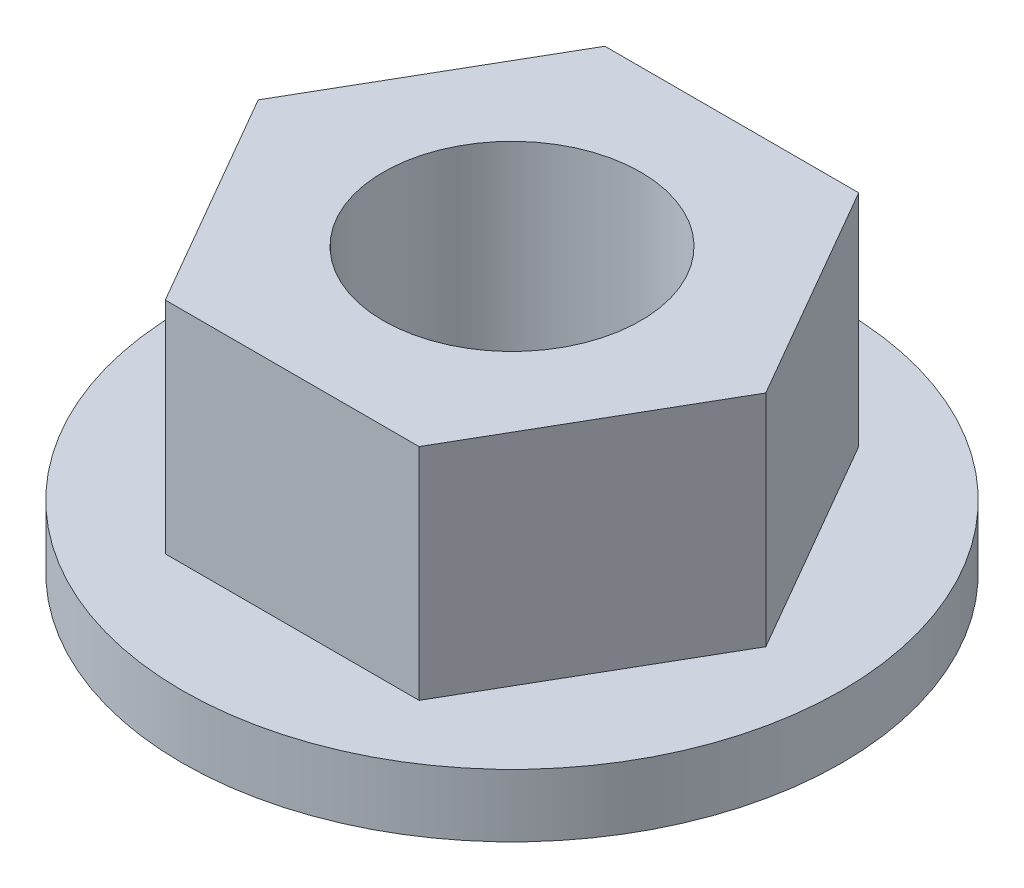
ISO-10303-21;
HEADER;
FILE_DESCRIPTION(('STEP AP214'),'2;1');
FILE_NAME('part.step','',(''),(''),'','','');
FILE_SCHEMA(('AUTOMOTIVE_DESIGN { 1 0 10303 214 1 1 1 1 }'));
ENDSEC;
DATA;
#1=APPLICATION_CONTEXT('core data for automotive mechanical design processes');
#2=APPLICATION_PROTOCOL_DEFINITION('international standard','automotive_design',2000,#1);
#3=PRODUCT_CONTEXT('',#1,'mechanical');
#4=PRODUCT('Part','Part','',(#3));
#5=PRODUCT_RELATED_PRODUCT_CATEGORY('part','',(#4));
#6=PRODUCT_DEFINITION_FORMATION('','',#4);
#7=PRODUCT_DEFINITION_CONTEXT('part definition',#1,'design');
#8=PRODUCT_DEFINITION('design','',#6,#7);
#9=PRODUCT_DEFINITION_SHAPE('','',#8);
#10=(LENGTH_UNIT() NAMED_UNIT(*) SI_UNIT(.MILLI.,.METRE.));
#11=(NAMED_UNIT(*) PLANE_ANGLE_UNIT() SI_UNIT($,.RADIAN.));
#12=(NAMED_UNIT(*) SI_UNIT($,.STERADIAN.) SOLID_ANGLE_UNIT());
#13=UNCERTAINTY_MEASURE_WITH_UNIT(LENGTH_MEASURE(1.E-05),#10,'distance_accuracy_value','');
#14=(GEOMETRIC_REPRESENTATION_CONTEXT(3) GLOBAL_UNCERTAINTY_ASSIGNED_CONTEXT((#13)) GLOBAL_UNIT_ASSIGNED_CONTEXT((#10,
#11,#12)) REPRESENTATION_CONTEXT('',''));
#15=CARTESIAN_POINT('',(0.,0.,0.));
#16=DIRECTION('',(0.,0.,1.));
#17=DIRECTION('',(1.,0.,0.));
#18=AXIS2_PLACEMENT_3D('',#15,#16,#17);
#19=CARTESIAN_POINT('',(-18.2709253038248,135.,-3.5));
#20=DIRECTION('',(0.866025403784438,0.,-0.5));
#21=DIRECTION('',(-0.5,0.,-0.866025403784439));
#22=AXIS2_PLACEMENT_3D('',#19,#20,#21);
#23=PLANE('',#22);
#24=DIRECTION('',(-0.5,0.,-0.866025403784439));
#25=VECTOR('',#24,1.);
#26=CARTESIAN_POINT('',(-18.2709253038248,138.5,-3.5));
#27=LINE('',#26,#25);
#28=CARTESIAN_POINT('',(-16.2501993616611,138.5,0.));
#29=VERTEX_POINT('',#28);
#30=CARTESIAN_POINT('',(-18.2709253038248,138.5,-3.5));
#31=VERTEX_POINT('',#30);
#32=EDGE_CURVE('E127',#29,#31,#27,.T.);
#33=ORIENTED_EDGE('',*,*,#32,.F.);
#34=DIRECTION('',(0.,1.,0.));
#35=VECTOR('',#34,1.);
#36=CARTESIAN_POINT('',(-16.2501993616611,135.,0.));
#37=LINE('',#36,#35);
#38=CARTESIAN_POINT('',(-16.2501993616611,135.,0.));
#39=VERTEX_POINT('',#38);
#40=EDGE_CURVE('E11',#39,#29,#37,.T.);
#41=ORIENTED_EDGE('',*,*,#40,.F.);
#42=DIRECTION('',(-0.5,0.,-0.866025403784439));
#43=VECTOR('',#42,1.);
#44=CARTESIAN_POINT('',(-18.2709253038248,135.,-3.5));
#45=LINE('',#44,#43);
#46=CARTESIAN_POINT('',(-18.2709253038248,135.,-3.5));
#47=VERTEX_POINT('',#46);
#48=EDGE_CURVE('E102',#39,#47,#45,.T.);
#49=ORIENTED_EDGE('',*,*,#48,.T.);
#50=DIRECTION('',(0.,1.,0.));
#51=VECTOR('',#50,1.);
#52=CARTESIAN_POINT('',(-18.2709253038248,135.,-3.5));
#53=LINE('',#52,#51);
#54=EDGE_CURVE('E113',#47,#31,#53,.T.);
#55=ORIENTED_EDGE('',*,*,#54,.T.);
#56=EDGE_LOOP('',(#33,#41,#49,#55));
#57=FACE_BOUND('',#56,.T.);
#58=ADVANCED_FACE('F39',(#57),#23,.T.);
#59=CARTESIAN_POINT('',(-16.2501993616611,135.,0.));
#60=DIRECTION('',(0.866025403784438,0.,0.5));
#61=DIRECTION('',(0.5,0.,-0.866025403784439));
#62=AXIS2_PLACEMENT_3D('',#59,#60,#61);
#63=PLANE('',#62);
#64=DIRECTION('',(0.5,0.,-0.866025403784439));
#65=VECTOR('',#64,1.);
#66=CARTESIAN_POINT('',(-16.2501993616611,138.5,0.));
#67=LINE('',#66,#65);
#68=CARTESIAN_POINT('',(-18.2709253038248,138.5,3.5));
#69=VERTEX_POINT('',#68);
#70=EDGE_CURVE('E96',#69,#29,#67,.T.);
#71=ORIENTED_EDGE('',*,*,#70,.F.);
#72=DIRECTION('',(0.,1.,0.));
#73=VECTOR('',#72,1.);
#74=CARTESIAN_POINT('',(-18.2709253038248,135.,3.5));
#75=LINE('',#74,#73);
#76=CARTESIAN_POINT('',(-18.2709253038248,135.,3.5));
#77=VERTEX_POINT('',#76);
#78=EDGE_CURVE('E48',#77,#69,#75,.T.);
#79=ORIENTED_EDGE('',*,*,#78,.F.);
#80=DIRECTION('',(0.5,0.,-0.866025403784439));
#81=VECTOR('',#80,1.);
#82=CARTESIAN_POINT('',(-16.2501993616611,135.,0.));
#83=LINE('',#82,#81);
#84=EDGE_CURVE('E116',#77,#39,#83,.T.);
#85=ORIENTED_EDGE('',*,*,#84,.T.);
#86=ORIENTED_EDGE('',*,*,#40,.T.);
#87=EDGE_LOOP('',(#71,#79,#85,#86));
#88=FACE_BOUND('',#87,.T.);
#89=ADVANCED_FACE('F101',(#88),#63,.T.);
#90=CARTESIAN_POINT('',(-18.2709253038248,135.,3.5));
#91=DIRECTION('',(0.,0.,1.));
#92=DIRECTION('',(1.,0.,0.));
#93=AXIS2_PLACEMENT_3D('',#90,#91,#92);
#94=PLANE('',#93);
#95=DIRECTION('',(1.,0.,0.));
#96=VECTOR('',#95,1.);
#97=CARTESIAN_POINT('',(-18.2709253038248,138.5,3.5));
#98=LINE('',#97,#96);
#99=CARTESIAN_POINT('',(-22.3123771881522,138.5,3.5));
#100=VERTEX_POINT('',#99);
#101=EDGE_CURVE('E85',#100,#69,#98,.T.);
#102=ORIENTED_EDGE('',*,*,#101,.F.);
#103=DIRECTION('',(0.,1.,0.));
#104=VECTOR('',#103,1.);
#105=CARTESIAN_POINT('',(-22.3123771881522,135.,3.5));
#106=LINE('',#105,#104);
#107=CARTESIAN_POINT('',(-22.3123771881522,135.,3.5));
#108=VERTEX_POINT('',#107);
#109=EDGE_CURVE('E89',#108,#100,#106,.T.);
#110=ORIENTED_EDGE('',*,*,#109,.F.);
#111=DIRECTION('',(1.,0.,0.));
#112=VECTOR('',#111,1.);
#113=CARTESIAN_POINT('',(-18.2709253038248,135.,3.5));
#114=LINE('',#113,#112);
#115=EDGE_CURVE('E88',#108,#77,#114,.T.);
#116=ORIENTED_EDGE('',*,*,#115,.T.);
#117=ORIENTED_EDGE('',*,*,#78,.T.);
#118=EDGE_LOOP('',(#102,#110,#116,#117));
#119=FACE_BOUND('',#118,.T.);
#120=ADVANCED_FACE('F80',(#119),#94,.T.);
#121=CARTESIAN_POINT('',(-22.3123771881522,135.,3.5));
#122=DIRECTION('',(-0.866025403784438,0.,0.5));
#123=DIRECTION('',(0.5,0.,0.866025403784439));
#124=AXIS2_PLACEMENT_3D('',#121,#122,#123);
#125=PLANE('',#124);
#126=DIRECTION('',(0.5,0.,0.866025403784439));
#127=VECTOR('',#126,1.);
#128=CARTESIAN_POINT('',(-22.3123771881522,138.5,3.5));
#129=LINE('',#128,#127);
#130=CARTESIAN_POINT('',(-24.3331031303159,138.5,0.));
#131=VERTEX_POINT('',#130);
#132=EDGE_CURVE('E97',#131,#100,#129,.T.);
#133=ORIENTED_EDGE('',*,*,#132,.F.);
#134=DIRECTION('',(0.,1.,0.));
#135=VECTOR('',#134,1.);
#136=CARTESIAN_POINT('',(-24.3331031303159,135.,0.));
#137=LINE('',#136,#135);
#138=CARTESIAN_POINT('',(-24.3331031303159,135.,0.));
#139=VERTEX_POINT('',#138);
#140=EDGE_CURVE('E115',#139,#131,#137,.T.);
#141=ORIENTED_EDGE('',*,*,#140,.F.);
#142=DIRECTION('',(0.5,0.,0.866025403784439));
#143=VECTOR('',#142,1.);
#144=CARTESIAN_POINT('',(-22.3123771881522,135.,3.5));
#145=LINE('',#144,#143);
#146=EDGE_CURVE('E125',#139,#108,#145,.T.);
#147=ORIENTED_EDGE('',*,*,#146,.T.);
#148=ORIENTED_EDGE('',*,*,#109,.T.);
#149=EDGE_LOOP('',(#133,#141,#147,#148));
#150=FACE_BOUND('',#149,.T.);
#151=ADVANCED_FACE('F143',(#150),#125,.T.);
#152=CARTESIAN_POINT('',(-24.3331031303159,135.,0.));
#153=DIRECTION('',(-0.866025403784439,0.,-0.499999999999999));
#154=DIRECTION('',(-0.499999999999999,0.,0.866025403784439));
#155=AXIS2_PLACEMENT_3D('',#152,#153,#154);
#156=PLANE('',#155);
#157=DIRECTION('',(-0.499999999999999,0.,0.866025403784439));
#158=VECTOR('',#157,1.);
#159=CARTESIAN_POINT('',(-24.3331031303159,138.5,0.));
#160=LINE('',#159,#158);
#161=CARTESIAN_POINT('',(-22.3123771881522,138.5,-3.5));
#162=VERTEX_POINT('',#161);
#163=EDGE_CURVE('E132',#162,#131,#160,.T.);
#164=ORIENTED_EDGE('',*,*,#163,.F.);
#165=DIRECTION('',(0.,1.,0.));
#166=VECTOR('',#165,1.);
#167=CARTESIAN_POINT('',(-22.3123771881522,135.,-3.5));
#168=LINE('',#167,#166);
#169=CARTESIAN_POINT('',(-22.3123771881522,135.,-3.5));
#170=VERTEX_POINT('',#169);
#171=EDGE_CURVE('E111',#170,#162,#168,.T.);
#172=ORIENTED_EDGE('',*,*,#171,.F.);
#173=DIRECTION('',(-0.499999999999999,0.,0.866025403784439));
#174=VECTOR('',#173,1.);
#175=CARTESIAN_POINT('',(-24.3331031303159,135.,0.));
#176=LINE('',#175,#174);
#177=EDGE_CURVE('E57',#170,#139,#176,.T.);
#178=ORIENTED_EDGE('',*,*,#177,.T.);
#179=ORIENTED_EDGE('',*,*,#140,.T.);
#180=EDGE_LOOP('',(#164,#172,#178,#179));
#181=FACE_BOUND('',#180,.T.);
#182=ADVANCED_FACE('F135',(#181),#156,.T.);
#183=CARTESIAN_POINT('',(-22.3123771881522,135.,-3.5));
#184=DIRECTION('',(0.,0.,-1.));
#185=DIRECTION('',(-1.,0.,0.));
#186=AXIS2_PLACEMENT_3D('',#183,#184,#185);
#187=PLANE('',#186);
#188=DIRECTION('',(-1.,0.,0.));
#189=VECTOR('',#188,1.);
#190=CARTESIAN_POINT('',(-22.3123771881522,138.5,-3.5));
#191=LINE('',#190,#189);
#192=EDGE_CURVE('E126',#31,#162,#191,.T.);
#193=ORIENTED_EDGE('',*,*,#192,.F.);
#194=ORIENTED_EDGE('',*,*,#54,.F.);
#195=DIRECTION('',(-1.,0.,0.));
#196=VECTOR('',#195,1.);
#197=CARTESIAN_POINT('',(-22.3123771881522,135.,-3.5));
#198=LINE('',#197,#196);
#199=EDGE_CURVE('E110',#47,#170,#198,.T.);
#200=ORIENTED_EDGE('',*,*,#199,.T.);
#201=ORIENTED_EDGE('',*,*,#171,.T.);
#202=EDGE_LOOP('',(#193,#194,#200,#201));
#203=FACE_BOUND('',#202,.T.);
#204=ADVANCED_FACE('F151',(#203),#187,.T.);
#205=CARTESIAN_POINT('',(0.,138.5,0.));
#206=DIRECTION('',(0.,-1.,0.));
#207=DIRECTION('',(0.,0.,-1.));
#208=AXIS2_PLACEMENT_3D('',#205,#206,#207);
#209=PLANE('',#208);
#210=CARTESIAN_POINT('',(-20.2916512459885,138.5,0.));
#211=DIRECTION('',(0.,-1.,0.));
#212=DIRECTION('',(0.,0.,-1.));
#213=AXIS2_PLACEMENT_3D('',#210,#211,#212);
#214=CIRCLE('',#213,2.05);
#215=CARTESIAN_POINT('',(-20.2916512459885,138.5,-2.05));
#216=VERTEX_POINT('',#215);
#217=EDGE_CURVE('E185',#216,#216,#214,.T.);
#218=ORIENTED_EDGE('',*,*,#217,.T.);
#219=EDGE_LOOP('',(#218));
#220=FACE_BOUND('',#219,.T.);
#221=ORIENTED_EDGE('',*,*,#32,.T.);
#222=ORIENTED_EDGE('',*,*,#192,.T.);
#223=ORIENTED_EDGE('',*,*,#163,.T.);
#224=ORIENTED_EDGE('',*,*,#132,.T.);
#225=ORIENTED_EDGE('',*,*,#101,.T.);
#226=ORIENTED_EDGE('',*,*,#70,.T.);
#227=EDGE_LOOP('',(#221,#222,#223,#224,#225,#226));
#228=FACE_BOUND('',#227,.T.);
#229=ADVANCED_FACE('F92',(#220,#228),#209,.F.);
#230=CARTESIAN_POINT('',(-20.2916512459885,135.,0.));
#231=DIRECTION('',(0.,1.,0.));
#232=DIRECTION('',(0.,0.,1.));
#233=AXIS2_PLACEMENT_3D('',#230,#231,#232);
#234=PLANE('',#233);
#235=CARTESIAN_POINT('',(-20.2916512459885,135.,0.));
#236=DIRECTION('',(0.,1.,0.));
#237=DIRECTION('',(0.,0.,1.));
#238=AXIS2_PLACEMENT_3D('',#235,#236,#237);
#239=CIRCLE('',#238,5.25);
#240=CARTESIAN_POINT('',(-20.2916512459885,135.,5.25));
#241=VERTEX_POINT('',#240);
#242=EDGE_CURVE('E184',#241,#241,#239,.T.);
#243=ORIENTED_EDGE('',*,*,#242,.T.);
#244=EDGE_LOOP('',(#243));
#245=FACE_BOUND('',#244,.T.);
#246=ORIENTED_EDGE('',*,*,#48,.F.);
#247=ORIENTED_EDGE('',*,*,#84,.F.);
#248=ORIENTED_EDGE('',*,*,#115,.F.);
#249=ORIENTED_EDGE('',*,*,#146,.F.);
#250=ORIENTED_EDGE('',*,*,#177,.F.);
#251=ORIENTED_EDGE('',*,*,#199,.F.);
#252=EDGE_LOOP('',(#246,#247,#248,#249,#250,#251));
#253=FACE_BOUND('',#252,.T.);
#254=ADVANCED_FACE('F146',(#245,#253),#234,.T.);
#255=CARTESIAN_POINT('',(-20.2916512459885,134.,0.));
#256=DIRECTION('',(0.,1.,0.));
#257=DIRECTION('',(0.,0.,1.));
#258=AXIS2_PLACEMENT_3D('',#255,#256,#257);
#259=CYLINDRICAL_SURFACE('',#258,5.25);
#260=CARTESIAN_POINT('',(-20.2916512459885,134.,0.));
#261=DIRECTION('',(0.,1.,0.));
#262=DIRECTION('',(0.,0.,1.));
#263=AXIS2_PLACEMENT_3D('',#260,#261,#262);
#264=CIRCLE('',#263,5.25);
#265=CARTESIAN_POINT('',(-20.2916512459885,134.,5.25));
#266=VERTEX_POINT('',#265);
#267=EDGE_CURVE('E129',#266,#266,#264,.T.);
#268=ORIENTED_EDGE('',*,*,#267,.T.);
#269=EDGE_LOOP('',(#268));
#270=FACE_BOUND('',#269,.T.);
#271=ORIENTED_EDGE('',*,*,#242,.F.);
#272=EDGE_LOOP('',(#271));
#273=FACE_BOUND('',#272,.T.);
#274=ADVANCED_FACE('F180',(#270,#273),#259,.T.);
#275=CARTESIAN_POINT('',(-20.2916512459885,134.,0.));
#276=DIRECTION('',(0.,1.,0.));
#277=DIRECTION('',(0.,0.,1.));
#278=AXIS2_PLACEMENT_3D('',#275,#276,#277);
#279=PLANE('',#278);
#280=CARTESIAN_POINT('',(-20.2916512459885,134.,0.));
#281=DIRECTION('',(0.,1.,0.));
#282=DIRECTION('',(0.,0.,1.));
#283=AXIS2_PLACEMENT_3D('',#280,#281,#282);
#284=CIRCLE('',#283,2.05);
#285=CARTESIAN_POINT('',(-20.2916512459885,134.,2.05));
#286=VERTEX_POINT('',#285);
#287=EDGE_CURVE('E45',#286,#286,#284,.T.);
#288=ORIENTED_EDGE('',*,*,#287,.T.);
#289=EDGE_LOOP('',(#288));
#290=FACE_BOUND('',#289,.T.);
#291=ORIENTED_EDGE('',*,*,#267,.F.);
#292=EDGE_LOOP('',(#291));
#293=FACE_BOUND('',#292,.T.);
#294=ADVANCED_FACE('F198',(#290,#293),#279,.F.);
#295=CARTESIAN_POINT('',(-20.2916512459885,133.9,0.));
#296=DIRECTION('',(0.,1.,0.));
#297=DIRECTION('',(0.,0.,1.));
#298=AXIS2_PLACEMENT_3D('',#295,#296,#297);
#299=CYLINDRICAL_SURFACE('',#298,2.05);
#300=ORIENTED_EDGE('',*,*,#287,.F.);
#301=EDGE_LOOP('',(#300));
#302=FACE_BOUND('',#301,.T.);
#303=ORIENTED_EDGE('',*,*,#217,.F.);
#304=EDGE_LOOP('',(#303));
#305=FACE_BOUND('',#304,.T.);
#306=ADVANCED_FACE('F197',(#302,#305),#299,.F.);
#307=CLOSED_SHELL('',(#58,#89,#120,#151,#182,#204,#229,#254,#274,#294,#306));
#308=MANIFOLD_SOLID_BREP('B2',#307);
#309=ADVANCED_BREP_SHAPE_REPRESENTATION('',(#18,#308),#14);
#310=SHAPE_DEFINITION_REPRESENTATION(#9,#309);
ENDSEC;
END-ISO-10303-21;
